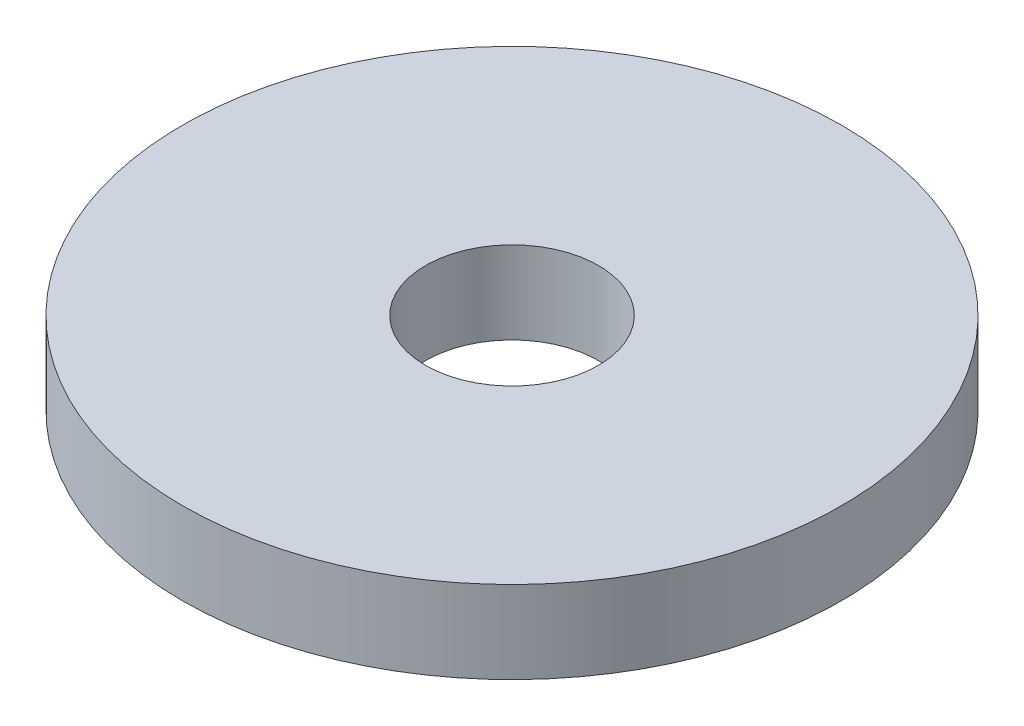
ISO-10303-21;
HEADER;
FILE_DESCRIPTION(('STEP AP214'),'2;1');
FILE_NAME('part.step','',(''),(''),'','','');
FILE_SCHEMA(('AUTOMOTIVE_DESIGN { 1 0 10303 214 1 1 1 1 }'));
ENDSEC;
DATA;
#1=APPLICATION_CONTEXT('core data for automotive mechanical design processes');
#2=APPLICATION_PROTOCOL_DEFINITION('international standard','automotive_design',2000,#1);
#3=PRODUCT_CONTEXT('',#1,'mechanical');
#4=PRODUCT('Part','Part','',(#3));
#5=PRODUCT_RELATED_PRODUCT_CATEGORY('part','',(#4));
#6=PRODUCT_DEFINITION_FORMATION('','',#4);
#7=PRODUCT_DEFINITION_CONTEXT('part definition',#1,'design');
#8=PRODUCT_DEFINITION('design','',#6,#7);
#9=PRODUCT_DEFINITION_SHAPE('','',#8);
#10=(LENGTH_UNIT() NAMED_UNIT(*) SI_UNIT(.MILLI.,.METRE.));
#11=(NAMED_UNIT(*) PLANE_ANGLE_UNIT() SI_UNIT($,.RADIAN.));
#12=(NAMED_UNIT(*) SI_UNIT($,.STERADIAN.) SOLID_ANGLE_UNIT());
#13=UNCERTAINTY_MEASURE_WITH_UNIT(LENGTH_MEASURE(1.E-05),#10,'distance_accuracy_value','');
#14=(GEOMETRIC_REPRESENTATION_CONTEXT(3) GLOBAL_UNCERTAINTY_ASSIGNED_CONTEXT((#13)) GLOBAL_UNIT_ASSIGNED_CONTEXT((#10,
#11,#12)) REPRESENTATION_CONTEXT('',''));
#15=CARTESIAN_POINT('',(0.,0.,0.));
#16=DIRECTION('',(0.,0.,1.));
#17=DIRECTION('',(1.,0.,0.));
#18=AXIS2_PLACEMENT_3D('',#15,#16,#17);
#19=CARTESIAN_POINT('',(0.,2.,0.));
#20=DIRECTION('',(0.,1.,0.));
#21=DIRECTION('',(0.,0.,1.));
#22=AXIS2_PLACEMENT_3D('',#19,#20,#21);
#23=PLANE('',#22);
#24=CARTESIAN_POINT('',(0.,2.,0.));
#25=DIRECTION('',(0.,1.,0.));
#26=DIRECTION('',(0.,0.,1.));
#27=AXIS2_PLACEMENT_3D('',#24,#25,#26);
#28=CIRCLE('',#27,8.);
#29=CARTESIAN_POINT('',(0.,2.,8.));
#30=VERTEX_POINT('',#29);
#31=EDGE_CURVE('E10',#30,#30,#28,.T.);
#32=ORIENTED_EDGE('',*,*,#31,.T.);
#33=EDGE_LOOP('',(#32));
#34=FACE_BOUND('',#33,.T.);
#35=CARTESIAN_POINT('',(0.,2.,0.));
#36=DIRECTION('',(0.,1.,0.));
#37=DIRECTION('',(0.,0.,1.));
#38=AXIS2_PLACEMENT_3D('',#35,#36,#37);
#39=CIRCLE('',#38,2.1);
#40=CARTESIAN_POINT('',(0.,2.,2.1));
#41=VERTEX_POINT('',#40);
#42=EDGE_CURVE('E54',#41,#41,#39,.T.);
#43=ORIENTED_EDGE('',*,*,#42,.F.);
#44=EDGE_LOOP('',(#43));
#45=FACE_BOUND('',#44,.T.);
#46=ADVANCED_FACE('F41',(#34,#45),#23,.T.);
#47=CARTESIAN_POINT('',(0.,0.,0.));
#48=DIRECTION('',(0.,1.,0.));
#49=DIRECTION('',(0.,0.,1.));
#50=AXIS2_PLACEMENT_3D('',#47,#48,#49);
#51=PLANE('',#50);
#52=CARTESIAN_POINT('',(0.,0.,0.));
#53=DIRECTION('',(0.,1.,0.));
#54=DIRECTION('',(0.,0.,1.));
#55=AXIS2_PLACEMENT_3D('',#52,#53,#54);
#56=CIRCLE('',#55,8.);
#57=CARTESIAN_POINT('',(0.,0.,8.));
#58=VERTEX_POINT('',#57);
#59=EDGE_CURVE('E45',#58,#58,#56,.T.);
#60=ORIENTED_EDGE('',*,*,#59,.F.);
#61=EDGE_LOOP('',(#60));
#62=FACE_BOUND('',#61,.T.);
#63=CARTESIAN_POINT('',(0.,0.,0.));
#64=DIRECTION('',(0.,1.,0.));
#65=DIRECTION('',(0.,0.,1.));
#66=AXIS2_PLACEMENT_3D('',#63,#64,#65);
#67=CIRCLE('',#66,2.1);
#68=CARTESIAN_POINT('',(0.,0.,2.1));
#69=VERTEX_POINT('',#68);
#70=EDGE_CURVE('E56',#69,#69,#67,.T.);
#71=ORIENTED_EDGE('',*,*,#70,.T.);
#72=EDGE_LOOP('',(#71));
#73=FACE_BOUND('',#72,.T.);
#74=ADVANCED_FACE('F68',(#62,#73),#51,.F.);
#75=CARTESIAN_POINT('',(0.,2.,0.));
#76=DIRECTION('',(0.,-1.,0.));
#77=DIRECTION('',(0.,0.,-1.));
#78=AXIS2_PLACEMENT_3D('',#75,#76,#77);
#79=CYLINDRICAL_SURFACE('',#78,8.);
#80=ORIENTED_EDGE('',*,*,#31,.F.);
#81=EDGE_LOOP('',(#80));
#82=FACE_BOUND('',#81,.T.);
#83=ORIENTED_EDGE('',*,*,#59,.T.);
#84=EDGE_LOOP('',(#83));
#85=FACE_BOUND('',#84,.T.);
#86=ADVANCED_FACE('F43',(#82,#85),#79,.T.);
#87=CARTESIAN_POINT('',(0.,2.,0.));
#88=DIRECTION('',(0.,-1.,0.));
#89=DIRECTION('',(0.,0.,-1.));
#90=AXIS2_PLACEMENT_3D('',#87,#88,#89);
#91=CYLINDRICAL_SURFACE('',#90,2.1);
#92=ORIENTED_EDGE('',*,*,#42,.T.);
#93=EDGE_LOOP('',(#92));
#94=FACE_BOUND('',#93,.T.);
#95=ORIENTED_EDGE('',*,*,#70,.F.);
#96=EDGE_LOOP('',(#95));
#97=FACE_BOUND('',#96,.T.);
#98=ADVANCED_FACE('F64',(#94,#97),#91,.F.);
#99=CLOSED_SHELL('',(#46,#74,#86,#98));
#100=MANIFOLD_SOLID_BREP('B2',#99);
#101=ADVANCED_BREP_SHAPE_REPRESENTATION('',(#18,#100),#14);
#102=SHAPE_DEFINITION_REPRESENTATION(#9,#101);
ENDSEC;
END-ISO-10303-21;
